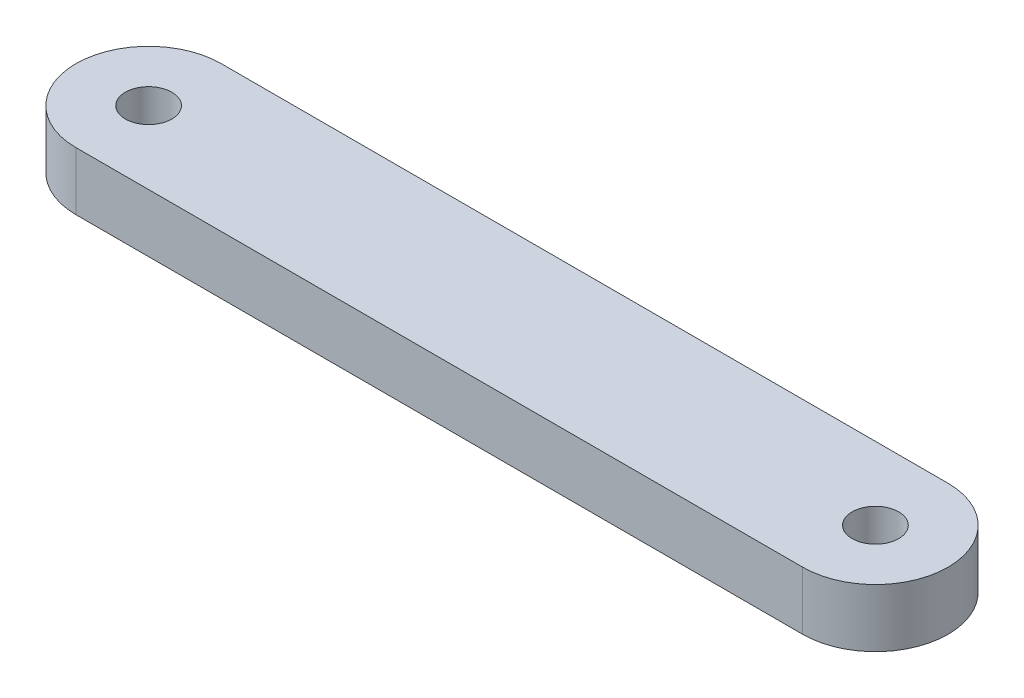
ISO-10303-21;
HEADER;
FILE_DESCRIPTION(('STEP AP214'),'2;1');
FILE_NAME('part.step','',(''),(''),'','','');
FILE_SCHEMA(('AUTOMOTIVE_DESIGN { 1 0 10303 214 1 1 1 1 }'));
ENDSEC;
DATA;
#1=APPLICATION_CONTEXT('core data for automotive mechanical design processes');
#2=APPLICATION_PROTOCOL_DEFINITION('international standard','automotive_design',2000,#1);
#3=PRODUCT_CONTEXT('',#1,'mechanical');
#4=PRODUCT('Part','Part','',(#3));
#5=PRODUCT_RELATED_PRODUCT_CATEGORY('part','',(#4));
#6=PRODUCT_DEFINITION_FORMATION('','',#4);
#7=PRODUCT_DEFINITION_CONTEXT('part definition',#1,'design');
#8=PRODUCT_DEFINITION('design','',#6,#7);
#9=PRODUCT_DEFINITION_SHAPE('','',#8);
#10=(LENGTH_UNIT() NAMED_UNIT(*) SI_UNIT(.MILLI.,.METRE.));
#11=(NAMED_UNIT(*) PLANE_ANGLE_UNIT() SI_UNIT($,.RADIAN.));
#12=(NAMED_UNIT(*) SI_UNIT($,.STERADIAN.) SOLID_ANGLE_UNIT());
#13=UNCERTAINTY_MEASURE_WITH_UNIT(LENGTH_MEASURE(1.E-05),#10,'distance_accuracy_value','');
#14=(GEOMETRIC_REPRESENTATION_CONTEXT(3) GLOBAL_UNCERTAINTY_ASSIGNED_CONTEXT((#13)) GLOBAL_UNIT_ASSIGNED_CONTEXT((#10,
#11,#12)) REPRESENTATION_CONTEXT('',''));
#15=CARTESIAN_POINT('',(0.,0.,0.));
#16=DIRECTION('',(0.,0.,1.));
#17=DIRECTION('',(1.,0.,0.));
#18=AXIS2_PLACEMENT_3D('',#15,#16,#17);
#19=CARTESIAN_POINT('',(50.,4.,0.));
#20=DIRECTION('',(0.,1.,0.));
#21=DIRECTION('',(0.,0.,1.));
#22=AXIS2_PLACEMENT_3D('',#19,#20,#21);
#23=PLANE('',#22);
#24=CARTESIAN_POINT('',(0.,4.,0.));
#25=DIRECTION('',(0.,1.,0.));
#26=DIRECTION('',(0.,0.,1.));
#27=AXIS2_PLACEMENT_3D('',#24,#25,#26);
#28=CIRCLE('',#27,1.6);
#29=CARTESIAN_POINT('',(0.,4.,1.6));
#30=VERTEX_POINT('',#29);
#31=EDGE_CURVE('E100',#30,#30,#28,.T.);
#32=ORIENTED_EDGE('',*,*,#31,.F.);
#33=EDGE_LOOP('',(#32));
#34=FACE_BOUND('',#33,.T.);
#35=CARTESIAN_POINT('',(50.,4.,0.));
#36=DIRECTION('',(0.,1.,0.));
#37=DIRECTION('',(0.,0.,1.));
#38=AXIS2_PLACEMENT_3D('',#35,#36,#37);
#39=CIRCLE('',#38,5.);
#40=CARTESIAN_POINT('',(50.,4.,5.));
#41=VERTEX_POINT('',#40);
#42=CARTESIAN_POINT('',(50.,4.,-5.));
#43=VERTEX_POINT('',#42);
#44=EDGE_CURVE('E85',#41,#43,#39,.T.);
#45=ORIENTED_EDGE('',*,*,#44,.T.);
#46=DIRECTION('',(-1.,0.,0.));
#47=VECTOR('',#46,1.);
#48=CARTESIAN_POINT('',(0.,4.,-5.));
#49=LINE('',#48,#47);
#50=CARTESIAN_POINT('',(0.,4.,-5.));
#51=VERTEX_POINT('',#50);
#52=EDGE_CURVE('E80',#43,#51,#49,.T.);
#53=ORIENTED_EDGE('',*,*,#52,.T.);
#54=CARTESIAN_POINT('',(0.,4.,0.));
#55=DIRECTION('',(0.,1.,0.));
#56=DIRECTION('',(0.,0.,1.));
#57=AXIS2_PLACEMENT_3D('',#54,#55,#56);
#58=CIRCLE('',#57,5.);
#59=CARTESIAN_POINT('',(0.,4.,5.));
#60=VERTEX_POINT('',#59);
#61=EDGE_CURVE('E83',#51,#60,#58,.T.);
#62=ORIENTED_EDGE('',*,*,#61,.T.);
#63=DIRECTION('',(1.,0.,0.));
#64=VECTOR('',#63,1.);
#65=CARTESIAN_POINT('',(0.,4.,5.));
#66=LINE('',#65,#64);
#67=EDGE_CURVE('E50',#60,#41,#66,.T.);
#68=ORIENTED_EDGE('',*,*,#67,.T.);
#69=EDGE_LOOP('',(#45,#53,#62,#68));
#70=FACE_BOUND('',#69,.T.);
#71=CARTESIAN_POINT('',(50.,4.,0.));
#72=DIRECTION('',(0.,1.,0.));
#73=DIRECTION('',(0.,0.,1.));
#74=AXIS2_PLACEMENT_3D('',#71,#72,#73);
#75=CIRCLE('',#74,1.60000000000001);
#76=CARTESIAN_POINT('',(50.,4.,1.60000000000001));
#77=VERTEX_POINT('',#76);
#78=EDGE_CURVE('E115',#77,#77,#75,.T.);
#79=ORIENTED_EDGE('',*,*,#78,.F.);
#80=EDGE_LOOP('',(#79));
#81=FACE_BOUND('',#80,.T.);
#82=ADVANCED_FACE('F33',(#34,#70,#81),#23,.T.);
#83=CARTESIAN_POINT('',(50.,0.,0.));
#84=DIRECTION('',(0.,1.,0.));
#85=DIRECTION('',(0.,0.,1.));
#86=AXIS2_PLACEMENT_3D('',#83,#84,#85);
#87=PLANE('',#86);
#88=CARTESIAN_POINT('',(50.,0.,0.));
#89=DIRECTION('',(0.,1.,0.));
#90=DIRECTION('',(0.,0.,1.));
#91=AXIS2_PLACEMENT_3D('',#88,#89,#90);
#92=CIRCLE('',#91,5.);
#93=CARTESIAN_POINT('',(50.,0.,5.));
#94=VERTEX_POINT('',#93);
#95=CARTESIAN_POINT('',(50.,0.,-5.));
#96=VERTEX_POINT('',#95);
#97=EDGE_CURVE('E97',#94,#96,#92,.T.);
#98=ORIENTED_EDGE('',*,*,#97,.F.);
#99=DIRECTION('',(1.,0.,0.));
#100=VECTOR('',#99,1.);
#101=CARTESIAN_POINT('',(0.,0.,5.));
#102=LINE('',#101,#100);
#103=CARTESIAN_POINT('',(0.,0.,5.));
#104=VERTEX_POINT('',#103);
#105=EDGE_CURVE('E73',#104,#94,#102,.T.);
#106=ORIENTED_EDGE('',*,*,#105,.F.);
#107=CARTESIAN_POINT('',(0.,0.,0.));
#108=DIRECTION('',(0.,1.,0.));
#109=DIRECTION('',(0.,0.,1.));
#110=AXIS2_PLACEMENT_3D('',#107,#108,#109);
#111=CIRCLE('',#110,5.);
#112=CARTESIAN_POINT('',(0.,0.,-5.));
#113=VERTEX_POINT('',#112);
#114=EDGE_CURVE('E67',#113,#104,#111,.T.);
#115=ORIENTED_EDGE('',*,*,#114,.F.);
#116=DIRECTION('',(-1.,0.,0.));
#117=VECTOR('',#116,1.);
#118=CARTESIAN_POINT('',(0.,0.,-5.));
#119=LINE('',#118,#117);
#120=EDGE_CURVE('E89',#96,#113,#119,.T.);
#121=ORIENTED_EDGE('',*,*,#120,.F.);
#122=EDGE_LOOP('',(#98,#106,#115,#121));
#123=FACE_BOUND('',#122,.T.);
#124=CARTESIAN_POINT('',(0.,0.,0.));
#125=DIRECTION('',(0.,1.,0.));
#126=DIRECTION('',(0.,0.,1.));
#127=AXIS2_PLACEMENT_3D('',#124,#125,#126);
#128=CIRCLE('',#127,1.6);
#129=CARTESIAN_POINT('',(0.,0.,1.6));
#130=VERTEX_POINT('',#129);
#131=EDGE_CURVE('E112',#130,#130,#128,.T.);
#132=ORIENTED_EDGE('',*,*,#131,.T.);
#133=EDGE_LOOP('',(#132));
#134=FACE_BOUND('',#133,.T.);
#135=CARTESIAN_POINT('',(50.,0.,0.));
#136=DIRECTION('',(0.,1.,0.));
#137=DIRECTION('',(0.,0.,1.));
#138=AXIS2_PLACEMENT_3D('',#135,#136,#137);
#139=CIRCLE('',#138,1.60000000000001);
#140=CARTESIAN_POINT('',(50.,0.,1.60000000000001));
#141=VERTEX_POINT('',#140);
#142=EDGE_CURVE('E118',#141,#141,#139,.T.);
#143=ORIENTED_EDGE('',*,*,#142,.T.);
#144=EDGE_LOOP('',(#143));
#145=FACE_BOUND('',#144,.T.);
#146=ADVANCED_FACE('F108',(#123,#134,#145),#87,.F.);
#147=CARTESIAN_POINT('',(50.,4.,0.));
#148=DIRECTION('',(0.,-1.,0.));
#149=DIRECTION('',(0.,0.,-1.));
#150=AXIS2_PLACEMENT_3D('',#147,#148,#149);
#151=CYLINDRICAL_SURFACE('',#150,5.);
#152=ORIENTED_EDGE('',*,*,#97,.T.);
#153=DIRECTION('',(0.,-1.,0.));
#154=VECTOR('',#153,1.);
#155=CARTESIAN_POINT('',(50.,4.,-5.));
#156=LINE('',#155,#154);
#157=EDGE_CURVE('E11',#43,#96,#156,.T.);
#158=ORIENTED_EDGE('',*,*,#157,.F.);
#159=ORIENTED_EDGE('',*,*,#44,.F.);
#160=DIRECTION('',(0.,-1.,0.));
#161=VECTOR('',#160,1.);
#162=CARTESIAN_POINT('',(50.,4.,5.));
#163=LINE('',#162,#161);
#164=EDGE_CURVE('E93',#41,#94,#163,.T.);
#165=ORIENTED_EDGE('',*,*,#164,.T.);
#166=EDGE_LOOP('',(#152,#158,#159,#165));
#167=FACE_BOUND('',#166,.T.);
#168=ADVANCED_FACE('F35',(#167),#151,.T.);
#169=CARTESIAN_POINT('',(0.,4.,-5.));
#170=DIRECTION('',(0.,0.,1.));
#171=DIRECTION('',(1.,0.,0.));
#172=AXIS2_PLACEMENT_3D('',#169,#170,#171);
#173=PLANE('',#172);
#174=ORIENTED_EDGE('',*,*,#120,.T.);
#175=DIRECTION('',(0.,-1.,0.));
#176=VECTOR('',#175,1.);
#177=CARTESIAN_POINT('',(0.,4.,-5.));
#178=LINE('',#177,#176);
#179=EDGE_CURVE('E42',#51,#113,#178,.T.);
#180=ORIENTED_EDGE('',*,*,#179,.F.);
#181=ORIENTED_EDGE('',*,*,#52,.F.);
#182=ORIENTED_EDGE('',*,*,#157,.T.);
#183=EDGE_LOOP('',(#174,#180,#181,#182));
#184=FACE_BOUND('',#183,.T.);
#185=ADVANCED_FACE('F88',(#184),#173,.F.);
#186=CARTESIAN_POINT('',(0.,4.,0.));
#187=DIRECTION('',(0.,-1.,0.));
#188=DIRECTION('',(0.,0.,-1.));
#189=AXIS2_PLACEMENT_3D('',#186,#187,#188);
#190=CYLINDRICAL_SURFACE('',#189,5.);
#191=ORIENTED_EDGE('',*,*,#114,.T.);
#192=DIRECTION('',(0.,-1.,0.));
#193=VECTOR('',#192,1.);
#194=CARTESIAN_POINT('',(0.,4.,5.));
#195=LINE('',#194,#193);
#196=EDGE_CURVE('E90',#60,#104,#195,.T.);
#197=ORIENTED_EDGE('',*,*,#196,.F.);
#198=ORIENTED_EDGE('',*,*,#61,.F.);
#199=ORIENTED_EDGE('',*,*,#179,.T.);
#200=EDGE_LOOP('',(#191,#197,#198,#199));
#201=FACE_BOUND('',#200,.T.);
#202=ADVANCED_FACE('F91',(#201),#190,.T.);
#203=CARTESIAN_POINT('',(0.,4.,5.));
#204=DIRECTION('',(0.,0.,-1.));
#205=DIRECTION('',(-1.,0.,0.));
#206=AXIS2_PLACEMENT_3D('',#203,#204,#205);
#207=PLANE('',#206);
#208=ORIENTED_EDGE('',*,*,#105,.T.);
#209=ORIENTED_EDGE('',*,*,#164,.F.);
#210=ORIENTED_EDGE('',*,*,#67,.F.);
#211=ORIENTED_EDGE('',*,*,#196,.T.);
#212=EDGE_LOOP('',(#208,#209,#210,#211));
#213=FACE_BOUND('',#212,.T.);
#214=ADVANCED_FACE('F105',(#213),#207,.F.);
#215=CARTESIAN_POINT('',(0.,4.,0.));
#216=DIRECTION('',(0.,-1.,0.));
#217=DIRECTION('',(0.,0.,-1.));
#218=AXIS2_PLACEMENT_3D('',#215,#216,#217);
#219=CYLINDRICAL_SURFACE('',#218,1.6);
#220=ORIENTED_EDGE('',*,*,#31,.T.);
#221=EDGE_LOOP('',(#220));
#222=FACE_BOUND('',#221,.T.);
#223=ORIENTED_EDGE('',*,*,#131,.F.);
#224=EDGE_LOOP('',(#223));
#225=FACE_BOUND('',#224,.T.);
#226=ADVANCED_FACE('F135',(#222,#225),#219,.F.);
#227=CARTESIAN_POINT('',(50.,4.,0.));
#228=DIRECTION('',(0.,-1.,0.));
#229=DIRECTION('',(0.,0.,-1.));
#230=AXIS2_PLACEMENT_3D('',#227,#228,#229);
#231=CYLINDRICAL_SURFACE('',#230,1.60000000000001);
#232=ORIENTED_EDGE('',*,*,#78,.T.);
#233=EDGE_LOOP('',(#232));
#234=FACE_BOUND('',#233,.T.);
#235=ORIENTED_EDGE('',*,*,#142,.F.);
#236=EDGE_LOOP('',(#235));
#237=FACE_BOUND('',#236,.T.);
#238=ADVANCED_FACE('F124',(#234,#237),#231,.F.);
#239=CLOSED_SHELL('',(#82,#146,#168,#185,#202,#214,#226,#238));
#240=MANIFOLD_SOLID_BREP('B2',#239);
#241=ADVANCED_BREP_SHAPE_REPRESENTATION('',(#18,#240),#14);
#242=SHAPE_DEFINITION_REPRESENTATION(#9,#241);
ENDSEC;
END-ISO-10303-21;
